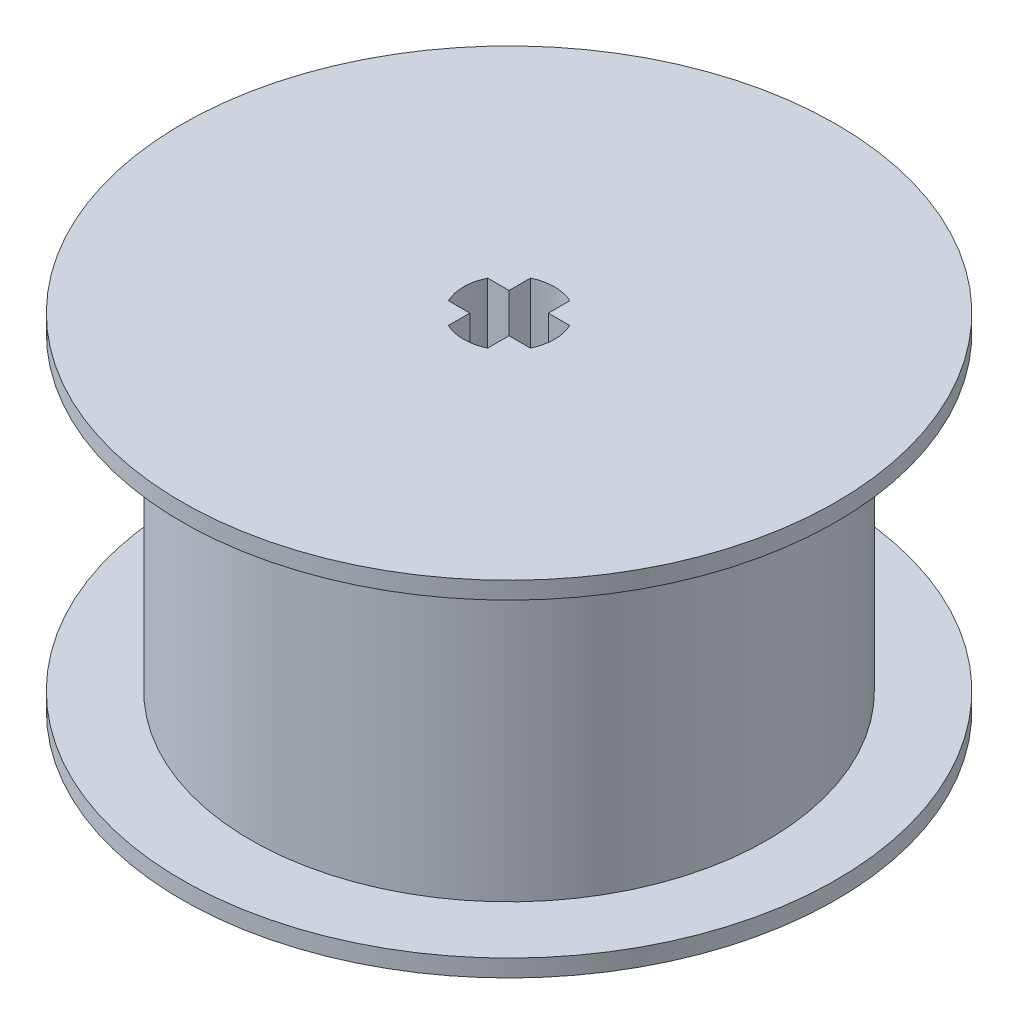
ISO-10303-21;
HEADER;
FILE_DESCRIPTION(('STEP AP214'),'2;1');
FILE_NAME('part.step','',(''),(''),'','','');
FILE_SCHEMA(('AUTOMOTIVE_DESIGN { 1 0 10303 214 1 1 1 1 }'));
ENDSEC;
DATA;
#1=APPLICATION_CONTEXT('core data for automotive mechanical design processes');
#2=APPLICATION_PROTOCOL_DEFINITION('international standard','automotive_design',2000,#1);
#3=PRODUCT_CONTEXT('',#1,'mechanical');
#4=PRODUCT('Part','Part','',(#3));
#5=PRODUCT_RELATED_PRODUCT_CATEGORY('part','',(#4));
#6=PRODUCT_DEFINITION_FORMATION('','',#4);
#7=PRODUCT_DEFINITION_CONTEXT('part definition',#1,'design');
#8=PRODUCT_DEFINITION('design','',#6,#7);
#9=PRODUCT_DEFINITION_SHAPE('','',#8);
#10=(LENGTH_UNIT() NAMED_UNIT(*) SI_UNIT(.MILLI.,.METRE.));
#11=(NAMED_UNIT(*) PLANE_ANGLE_UNIT() SI_UNIT($,.RADIAN.));
#12=(NAMED_UNIT(*) SI_UNIT($,.STERADIAN.) SOLID_ANGLE_UNIT());
#13=UNCERTAINTY_MEASURE_WITH_UNIT(LENGTH_MEASURE(1.E-05),#10,'distance_accuracy_value','');
#14=(GEOMETRIC_REPRESENTATION_CONTEXT(3) GLOBAL_UNCERTAINTY_ASSIGNED_CONTEXT((#13)) GLOBAL_UNIT_ASSIGNED_CONTEXT((#10,
#11,#12)) REPRESENTATION_CONTEXT('',''));
#15=CARTESIAN_POINT('',(0.,0.,0.));
#16=DIRECTION('',(0.,0.,1.));
#17=DIRECTION('',(1.,0.,0.));
#18=AXIS2_PLACEMENT_3D('',#15,#16,#17);
#19=CARTESIAN_POINT('',(0.,0.,0.));
#20=DIRECTION('',(0.,1.,0.));
#21=DIRECTION('',(0.,0.,1.));
#22=AXIS2_PLACEMENT_3D('',#19,#20,#21);
#23=PLANE('',#22);
#24=DIRECTION('',(0.,0.,1.));
#25=VECTOR('',#24,1.);
#26=CARTESIAN_POINT('',(-1.14,0.,-2.38117617995813));
#27=LINE('',#26,#25);
#28=CARTESIAN_POINT('',(-1.14,0.,-2.38117617995813));
#29=VERTEX_POINT('',#28);
#30=CARTESIAN_POINT('',(-1.14,0.,-1.14000000000001));
#31=VERTEX_POINT('',#30);
#32=EDGE_CURVE('E60',#29,#31,#27,.T.);
#33=ORIENTED_EDGE('',*,*,#32,.F.);
#34=CARTESIAN_POINT('',(0.,0.,0.));
#35=DIRECTION('',(0.,1.,0.));
#36=DIRECTION('',(0.,0.,-1.));
#37=AXIS2_PLACEMENT_3D('',#34,#35,#36);
#38=CIRCLE('',#37,2.64);
#39=CARTESIAN_POINT('',(1.14,0.,-2.38117617995813));
#40=VERTEX_POINT('',#39);
#41=EDGE_CURVE('E153',#40,#29,#38,.T.);
#42=ORIENTED_EDGE('',*,*,#41,.F.);
#43=DIRECTION('',(0.,0.,-1.));
#44=VECTOR('',#43,1.);
#45=CARTESIAN_POINT('',(1.14,0.,-2.38117617995813));
#46=LINE('',#45,#44);
#47=CARTESIAN_POINT('',(1.14,0.,-1.14));
#48=VERTEX_POINT('',#47);
#49=EDGE_CURVE('E156',#48,#40,#46,.T.);
#50=ORIENTED_EDGE('',*,*,#49,.F.);
#51=DIRECTION('',(-1.,0.,0.));
#52=VECTOR('',#51,1.);
#53=CARTESIAN_POINT('',(1.14,0.,-1.14));
#54=LINE('',#53,#52);
#55=CARTESIAN_POINT('',(2.38117617995813,0.,-1.14));
#56=VERTEX_POINT('',#55);
#57=EDGE_CURVE('E208',#56,#48,#54,.T.);
#58=ORIENTED_EDGE('',*,*,#57,.F.);
#59=CARTESIAN_POINT('',(0.,0.,0.));
#60=DIRECTION('',(0.,1.,0.));
#61=DIRECTION('',(0.,0.,-1.));
#62=AXIS2_PLACEMENT_3D('',#59,#60,#61);
#63=CIRCLE('',#62,2.64);
#64=CARTESIAN_POINT('',(2.38117617995813,0.,1.14));
#65=VERTEX_POINT('',#64);
#66=EDGE_CURVE('E205',#65,#56,#63,.T.);
#67=ORIENTED_EDGE('',*,*,#66,.F.);
#68=DIRECTION('',(1.,0.,0.));
#69=VECTOR('',#68,1.);
#70=CARTESIAN_POINT('',(1.14,0.,1.14));
#71=LINE('',#70,#69);
#72=CARTESIAN_POINT('',(1.14,0.,1.14));
#73=VERTEX_POINT('',#72);
#74=EDGE_CURVE('E202',#73,#65,#71,.T.);
#75=ORIENTED_EDGE('',*,*,#74,.F.);
#76=DIRECTION('',(0.,0.,-1.));
#77=VECTOR('',#76,1.);
#78=CARTESIAN_POINT('',(1.14,0.,2.38117617995813));
#79=LINE('',#78,#77);
#80=CARTESIAN_POINT('',(1.14,0.,2.38117617995813));
#81=VERTEX_POINT('',#80);
#82=EDGE_CURVE('E199',#81,#73,#79,.T.);
#83=ORIENTED_EDGE('',*,*,#82,.F.);
#84=CARTESIAN_POINT('',(0.,0.,0.));
#85=DIRECTION('',(0.,1.,0.));
#86=DIRECTION('',(0.,0.,1.));
#87=AXIS2_PLACEMENT_3D('',#84,#85,#86);
#88=CIRCLE('',#87,2.64);
#89=CARTESIAN_POINT('',(-1.14,0.,2.38117617995813));
#90=VERTEX_POINT('',#89);
#91=EDGE_CURVE('E196',#90,#81,#88,.T.);
#92=ORIENTED_EDGE('',*,*,#91,.F.);
#93=DIRECTION('',(0.,0.,1.));
#94=VECTOR('',#93,1.);
#95=CARTESIAN_POINT('',(-1.14,0.,1.14000000000001));
#96=LINE('',#95,#94);
#97=CARTESIAN_POINT('',(-1.14,0.,1.14000000000001));
#98=VERTEX_POINT('',#97);
#99=EDGE_CURVE('E193',#98,#90,#96,.T.);
#100=ORIENTED_EDGE('',*,*,#99,.F.);
#101=DIRECTION('',(1.,0.,0.));
#102=VECTOR('',#101,1.);
#103=CARTESIAN_POINT('',(-2.38117617995813,0.,1.14000000000001));
#104=LINE('',#103,#102);
#105=CARTESIAN_POINT('',(-2.38117617995813,0.,1.14000000000001));
#106=VERTEX_POINT('',#105);
#107=EDGE_CURVE('E190',#106,#98,#104,.T.);
#108=ORIENTED_EDGE('',*,*,#107,.F.);
#109=CARTESIAN_POINT('',(0.,0.,0.));
#110=DIRECTION('',(0.,1.,0.));
#111=DIRECTION('',(0.,0.,1.));
#112=AXIS2_PLACEMENT_3D('',#109,#110,#111);
#113=CIRCLE('',#112,2.64);
#114=CARTESIAN_POINT('',(-2.38117617995813,0.,-1.14000000000001));
#115=VERTEX_POINT('',#114);
#116=EDGE_CURVE('E187',#115,#106,#113,.T.);
#117=ORIENTED_EDGE('',*,*,#116,.F.);
#118=DIRECTION('',(-1.,0.,0.));
#119=VECTOR('',#118,1.);
#120=CARTESIAN_POINT('',(-1.14,0.,-1.14000000000001));
#121=LINE('',#120,#119);
#122=EDGE_CURVE('E185',#31,#115,#121,.T.);
#123=ORIENTED_EDGE('',*,*,#122,.F.);
#124=EDGE_LOOP('',(#33,#42,#50,#58,#67,#75,#83,#92,#100,#108,#117,#123));
#125=FACE_BOUND('',#124,.T.);
#126=CARTESIAN_POINT('',(0.,0.,0.));
#127=DIRECTION('',(0.,-1.,0.));
#128=DIRECTION('',(0.,0.,-1.));
#129=AXIS2_PLACEMENT_3D('',#126,#127,#128);
#130=CIRCLE('',#129,19.);
#131=CARTESIAN_POINT('',(0.,0.,-19.));
#132=VERTEX_POINT('',#131);
#133=EDGE_CURVE('E11',#132,#132,#130,.T.);
#134=ORIENTED_EDGE('',*,*,#133,.F.);
#135=EDGE_LOOP('',(#134));
#136=FACE_BOUND('',#135,.T.);
#137=ADVANCED_FACE('F39',(#125,#136),#23,.T.);
#138=CARTESIAN_POINT('',(0.,0.,0.));
#139=DIRECTION('',(0.,-1.,0.));
#140=DIRECTION('',(0.,0.,-1.));
#141=AXIS2_PLACEMENT_3D('',#138,#139,#140);
#142=CYLINDRICAL_SURFACE('',#141,19.);
#143=ORIENTED_EDGE('',*,*,#133,.T.);
#144=EDGE_LOOP('',(#143));
#145=FACE_BOUND('',#144,.T.);
#146=CARTESIAN_POINT('',(0.,-1.00000000003674,0.));
#147=DIRECTION('',(0.,-1.,0.));
#148=DIRECTION('',(0.,0.,-1.));
#149=AXIS2_PLACEMENT_3D('',#146,#147,#148);
#150=CIRCLE('',#149,19.);
#151=CARTESIAN_POINT('',(0.,-1.00000000003674,-19.));
#152=VERTEX_POINT('',#151);
#153=EDGE_CURVE('E52',#152,#152,#150,.T.);
#154=ORIENTED_EDGE('',*,*,#153,.F.);
#155=EDGE_LOOP('',(#154));
#156=FACE_BOUND('',#155,.T.);
#157=ADVANCED_FACE('F321',(#145,#156),#142,.T.);
#158=CARTESIAN_POINT('',(19.,-1.00000000003674,0.));
#159=DIRECTION('',(0.,-1.,0.));
#160=DIRECTION('',(0.,0.,-1.));
#161=AXIS2_PLACEMENT_3D('',#158,#159,#160);
#162=PLANE('',#161);
#163=ORIENTED_EDGE('',*,*,#153,.T.);
#164=EDGE_LOOP('',(#163));
#165=FACE_BOUND('',#164,.T.);
#166=CARTESIAN_POINT('',(0.,-1.00000000003674,0.));
#167=DIRECTION('',(0.,-1.,0.));
#168=DIRECTION('',(0.,0.,-1.));
#169=AXIS2_PLACEMENT_3D('',#166,#167,#168);
#170=CIRCLE('',#169,15.);
#171=CARTESIAN_POINT('',(0.,-1.00000000003674,-15.));
#172=VERTEX_POINT('',#171);
#173=EDGE_CURVE('E243',#172,#172,#170,.T.);
#174=ORIENTED_EDGE('',*,*,#173,.F.);
#175=EDGE_LOOP('',(#174));
#176=FACE_BOUND('',#175,.T.);
#177=ADVANCED_FACE('F317',(#165,#176),#162,.T.);
#178=CARTESIAN_POINT('',(0.,0.,0.));
#179=DIRECTION('',(0.,-1.,0.));
#180=DIRECTION('',(0.,0.,-1.));
#181=AXIS2_PLACEMENT_3D('',#178,#179,#180);
#182=CYLINDRICAL_SURFACE('',#181,15.);
#183=CARTESIAN_POINT('',(-6.53834841531102,-10.,-13.5));
#184=CARTESIAN_POINT('',(-6.53835429126218,-10.0405016305336,-13.4999973519819));
#185=CARTESIAN_POINT('',(-6.54178157028006,-10.0810615852994,-13.4983388832959));
#186=CARTESIAN_POINT('',(-6.55507308129075,-10.1608838437564,-13.4918889448347));
#187=CARTESIAN_POINT('',(-6.56495346795088,-10.2001426302494,-13.4870896121804));
#188=CARTESIAN_POINT('',(-6.59343086179107,-10.2864994275955,-13.4731947553589));
#189=CARTESIAN_POINT('',(-6.61364096152651,-10.3329288663731,-13.4632992649842));
#190=CARTESIAN_POINT('',(-6.66032970063838,-10.4216053361737,-13.4402637496393));
#191=CARTESIAN_POINT('',(-6.68682091248429,-10.4638437345906,-13.4271172149793));
#192=CARTESIAN_POINT('',(-6.76372444927527,-10.5717913416363,-13.3886109557115));
#193=CARTESIAN_POINT('',(-6.81811878371292,-10.6338322441521,-13.3610415174007));
#194=CARTESIAN_POINT('',(-6.93371129068838,-10.7486536141605,-13.3014259206052));
#195=CARTESIAN_POINT('',(-6.99492843184171,-10.8014071566226,-13.2693672144329));
#196=CARTESIAN_POINT('',(-7.12078187083078,-10.8989133143383,-13.2022538736608));
#197=CARTESIAN_POINT('',(-7.18538113839335,-10.9437356791897,-13.1672298246477));
#198=CARTESIAN_POINT('',(-7.31707104039202,-11.027188313925,-13.0945081380897));
#199=CARTESIAN_POINT('',(-7.38416389839497,-11.0658128856699,-13.0568080856782));
#200=CARTESIAN_POINT('',(-7.52003792075561,-11.137677719715,-12.9790281437519));
#201=CARTESIAN_POINT('',(-7.58882226093293,-11.1709067946085,-12.9389435391236));
#202=CARTESIAN_POINT('',(-7.72737151439541,-11.2323691155415,-12.8566802804563));
#203=CARTESIAN_POINT('',(-7.79713667141198,-11.2606010952483,-12.8145010990805));
#204=CARTESIAN_POINT('',(-7.96868961680108,-11.3239680620282,-12.708823086312));
#205=CARTESIAN_POINT('',(-8.07078698156116,-11.356508579231,-12.6442571838885));
#206=CARTESIAN_POINT('',(-8.27523656311224,-11.4119633650581,-12.5114084661272));
#207=CARTESIAN_POINT('',(-8.37758888623962,-11.4348725263219,-12.4431237003566));
#208=CARTESIAN_POINT('',(-8.58161097503527,-11.4707857532133,-12.3033010942913));
#209=CARTESIAN_POINT('',(-8.68328150279866,-11.4838038189781,-12.2317680044299));
#210=CARTESIAN_POINT('',(-8.88527489739756,-11.499336842331,-12.0858352082563));
#211=CARTESIAN_POINT('',(-8.98559853716563,-11.5018581051188,-12.011437249924));
#212=CARTESIAN_POINT('',(-9.21463010487043,-11.494407571697,-11.8371081982897));
#213=CARTESIAN_POINT('',(-9.34261048720523,-11.4803686547908,-11.7363419483686));
#214=CARTESIAN_POINT('',(-9.59243197710365,-11.4293045715253,-11.5330406681261));
#215=CARTESIAN_POINT('',(-9.71428352186695,-11.3923200199036,-11.4305090736368));
#216=CARTESIAN_POINT('',(-9.91346875256681,-11.3058747108413,-11.2576678893414));
#217=CARTESIAN_POINT('',(-9.99330650404348,-11.2633437082381,-11.1868009789055));
#218=CARTESIAN_POINT('',(-10.1459795190701,-11.1627397569323,-11.0485123468994));
#219=CARTESIAN_POINT('',(-10.2188243874304,-11.1046885528527,-10.9810859611722));
#220=CARTESIAN_POINT('',(-10.3365350001259,-10.9889998670556,-10.8701788665022));
#221=CARTESIAN_POINT('',(-10.3837132361054,-10.9352904369161,-10.8250725128944));
#222=CARTESIAN_POINT('',(-10.4708974295383,-10.81823114901,-10.7407619024324));
#223=CARTESIAN_POINT('',(-10.5109131229372,-10.7548945973138,-10.7015496456189));
#224=CARTESIAN_POINT('',(-10.5749249286873,-10.6320469110136,-10.6382609821206));
#225=CARTESIAN_POINT('',(-10.6005214358104,-10.5741291907398,-10.6127240439285));
#226=CARTESIAN_POINT('',(-10.6444935080157,-10.4530899743706,-10.5686201068699));
#227=CARTESIAN_POINT('',(-10.6628728358564,-10.3899712107217,-10.5500494762658));
#228=CARTESIAN_POINT('',(-10.6914200185456,-10.2596063561992,-10.5211198511226));
#229=CARTESIAN_POINT('',(-10.7015347629681,-10.1923365127666,-10.5108139758285));
#230=CARTESIAN_POINT('',(-10.7126307626969,-10.0562776421528,-10.4995052705286));
#231=CARTESIAN_POINT('',(-10.7136162264551,-9.98748932962245,-10.498498153945));
#232=CARTESIAN_POINT('',(-10.7067846399155,-9.85821098137139,-10.5054640690018));
#233=CARTESIAN_POINT('',(-10.6998921814574,-9.79761614017976,-10.5124938705573));
#234=CARTESIAN_POINT('',(-10.6791807043203,-9.67889353313731,-10.5335328936008));
#235=CARTESIAN_POINT('',(-10.6653614899103,-9.6207658370516,-10.5475423123137));
#236=CARTESIAN_POINT('',(-10.6311299110019,-9.5070346492436,-10.582044858114));
#237=CARTESIAN_POINT('',(-10.6105791125476,-9.45151488594607,-10.6026739179409));
#238=CARTESIAN_POINT('',(-10.5638934484072,-9.34526151956065,-10.6491898066595));
#239=CARTESIAN_POINT('',(-10.5377558039763,-9.29453031633951,-10.6750792516055));
#240=CARTESIAN_POINT('',(-10.4673514387406,-9.17556767854391,-10.7442065581145));
#241=CARTESIAN_POINT('',(-10.4203466585636,-9.11035877698943,-10.789869652819));
#242=CARTESIAN_POINT('',(-10.3186942756334,-8.99131162082975,-10.8871269396656));
#243=CARTESIAN_POINT('',(-10.264030025045,-8.93749879310096,-10.938734006318));
#244=CARTESIAN_POINT('',(-10.1246636360607,-8.82010101453543,-11.0681337321942));
#245=CARTESIAN_POINT('',(-10.037043865499,-8.76202738517832,-11.1477609470822));
#246=CARTESIAN_POINT('',(-9.85419165409301,-8.66490914856395,-11.3097266638254));
#247=CARTESIAN_POINT('',(-9.75894645495867,-8.62589724242037,-11.3920695680871));
#248=CARTESIAN_POINT('',(-9.58831945729434,-8.57215517257197,-11.5357374890118));
#249=CARTESIAN_POINT('',(-9.51405198034325,-8.55377203877791,-11.5970778212664));
#250=CARTESIAN_POINT('',(-9.36336448090554,-8.52520795296039,-11.719078546046));
#251=CARTESIAN_POINT('',(-9.28694340672785,-8.51503108283482,-11.7797385854106));
#252=CARTESIAN_POINT('',(-9.13244008207584,-8.50212086820539,-11.8999217147279));
#253=CARTESIAN_POINT('',(-9.05435556201105,-8.49939845022535,-11.9594430088742));
#254=CARTESIAN_POINT('',(-8.89709376930322,-8.50082161332319,-12.0768933780442));
#255=CARTESIAN_POINT('',(-8.81791667043208,-8.50496611444033,-12.1348227019807));
#256=CARTESIAN_POINT('',(-8.6554271934134,-8.51998319610775,-12.2512854712461));
#257=CARTESIAN_POINT('',(-8.57208317789145,-8.53113689817291,-12.3097381412123));
#258=CARTESIAN_POINT('',(-8.40501218139731,-8.56007949212183,-12.4244130098181));
#259=CARTESIAN_POINT('',(-8.32128517295241,-8.5778688676062,-12.4806350455611));
#260=CARTESIAN_POINT('',(-8.15398161299101,-8.61989835076576,-12.5905752236938));
#261=CARTESIAN_POINT('',(-8.07040501871651,-8.64412911221757,-12.6442968624125));
#262=CARTESIAN_POINT('',(-7.90379309562159,-8.69910146506953,-12.7491076867998));
#263=CARTESIAN_POINT('',(-7.82075760462673,-8.72984100357186,-12.8001976961942));
#264=CARTESIAN_POINT('',(-7.63604009929688,-8.80631296558693,-12.9114323032474));
#265=CARTESIAN_POINT('',(-7.53464021120842,-8.85387275107374,-12.9708258665554));
#266=CARTESIAN_POINT('',(-7.38515224635336,-8.93412827837651,-13.0561417761549));
#267=CARTESIAN_POINT('',(-7.33573806961938,-8.96237981078635,-13.0839622101497));
#268=CARTESIAN_POINT('',(-7.23815391541254,-9.02217851039933,-13.1381977392378));
#269=CARTESIAN_POINT('',(-7.18998364382187,-9.05372488947938,-13.1646131681352));
#270=CARTESIAN_POINT('',(-7.07336572376163,-9.13604496427244,-13.227762269043));
#271=CARTESIAN_POINT('',(-7.00589850684287,-9.18894080425484,-13.2635858536544));
#272=CARTESIAN_POINT('',(-6.87735217958041,-9.30449086762637,-13.3306870399593));
#273=CARTESIAN_POINT('',(-6.81625404063946,-9.36711454480026,-13.3619782985551));
#274=CARTESIAN_POINT('',(-6.73187816208705,-9.47211904976236,-13.4045852683564));
#275=CARTESIAN_POINT('',(-6.70437379067559,-9.51007770054133,-13.4183520280532));
#276=CARTESIAN_POINT('',(-6.65397606472866,-9.5897591992035,-13.4434142795373));
#277=CARTESIAN_POINT('',(-6.63108006275475,-9.6314798658015,-13.4547111905388));
#278=CARTESIAN_POINT('',(-6.59468030973018,-9.71202681689303,-13.472584849673));
#279=CARTESIAN_POINT('',(-6.58028080854931,-9.75034055285035,-13.4796165355107));
#280=CARTESIAN_POINT('',(-6.55741568335751,-9.82907164609291,-13.4907548185578));
#281=CARTESIAN_POINT('',(-6.54893235569477,-9.86948233507261,-13.494870143335));
#282=CARTESIAN_POINT('',(-6.54204465665132,-9.92521786548193,-13.4982093087091));
#283=CARTESIAN_POINT('',(-6.54066214604548,-9.94012917549613,-13.4988792091831));
#284=CARTESIAN_POINT('',(-6.53881284514107,-9.97002431721489,-13.4997750898697));
#285=CARTESIAN_POINT('',(-6.53834624030471,-9.98500816299163,-13.5000009801743));
#286=CARTESIAN_POINT('',(-6.53834841531102,-10.,-13.5));
#287=B_SPLINE_CURVE_WITH_KNOTS('',3,(#183,#184,#185,#186,#187,#188,#189,#190,#191,#192,#193,
#194,#195,#196,#197,#198,#199,#200,#201,#202,#203,#204,#205,#206,#207,#208,#209,#210,#211,#212,
#213,#214,#215,#216,#217,#218,#219,#220,#221,#222,#223,#224,#225,#226,#227,#228,#229,#230,#231,
#232,#233,#234,#235,#236,#237,#238,#239,#240,#241,#242,#243,#244,#245,#246,#247,#248,#249,#250,
#251,#252,#253,#254,#255,#256,#257,#258,#259,#260,#261,#262,#263,#264,#265,#266,#267,#268,#269,
#270,#271,#272,#273,#274,#275,#276,#277,#278,#279,#280,#281,#282,#283,#284,#285,#286),
.UNSPECIFIED.,.T.,.F.,(4,2,2,2,2,2,2,2,2,2,2,2,2,2,2,2,2,2,2,2,2,2,2,2,2,2,2,2,2,2,2,2,2,2,2,2,
2,2,2,2,2,2,2,2,2,2,2,2,2,2,2,4),(0.,0.121439420041992,0.243184022044381,0.397087579827664,
0.55130183584928,0.810822442907293,1.07108346281782,1.32892762791405,1.58700750858907,
1.84561585945676,2.10428965170149,2.47914056641775,2.85419000886441,3.22870760163308,
3.60300019739216,4.09204400132706,4.58022463715456,4.92395551843944,5.26720731564088,
5.51993902789394,5.77232455250974,5.97633765736867,6.1802442559988,6.38545112950289,
6.59056340122062,6.77387176033376,6.95718529953153,7.1445339772348,7.33197605479737,
7.60777064878839,7.88417425821165,8.27762216586976,8.67174269905323,8.96555264762777,
9.25950865093959,9.55389529652888,9.84823564830917,10.1552084893841,10.462203706676,
10.7687558932824,11.0752115355814,11.4548455852621,11.6448219553577,11.834752986972,
12.1129538612206,12.390298191189,12.536556050179,12.6827296449037,12.8068562382908,
12.9306097807685,12.9755519578145,13.020503234286),.UNSPECIFIED.);
#288=CARTESIAN_POINT('',(-6.53834841531102,-10.,-13.5));
#289=VERTEX_POINT('',#288);
#290=EDGE_CURVE('E42',#289,#289,#287,.T.);
#291=ORIENTED_EDGE('',*,*,#290,.F.);
#292=EDGE_LOOP('',(#291));
#293=FACE_BOUND('',#292,.T.);
#294=CARTESIAN_POINT('',(6.53834841531102,-10.,-13.5));
#295=CARTESIAN_POINT('',(6.53835429126218,-9.95949836946645,-13.4999973519819));
#296=CARTESIAN_POINT('',(6.54178157028006,-9.91893841470063,-13.4983388832959));
#297=CARTESIAN_POINT('',(6.55507308129075,-9.83911615624359,-13.4918889448347));
#298=CARTESIAN_POINT('',(6.56495346795088,-9.79985736975057,-13.4870896121804));
#299=CARTESIAN_POINT('',(6.59343086179107,-9.71350057240451,-13.4731947553589));
#300=CARTESIAN_POINT('',(6.61364096152651,-9.66707113362695,-13.4632992649842));
#301=CARTESIAN_POINT('',(6.66032970063838,-9.57839466382634,-13.4402637496393));
#302=CARTESIAN_POINT('',(6.68682091248429,-9.53615626540945,-13.4271172149793));
#303=CARTESIAN_POINT('',(6.76372444927527,-9.42820865836374,-13.3886109557115));
#304=CARTESIAN_POINT('',(6.81811878371292,-9.36616775584793,-13.3610415174007));
#305=CARTESIAN_POINT('',(6.93371129068838,-9.25134638583947,-13.3014259206052));
#306=CARTESIAN_POINT('',(6.99492843184171,-9.19859284337741,-13.2693672144329));
#307=CARTESIAN_POINT('',(7.12078187083078,-9.10108668566171,-13.2022538736608));
#308=CARTESIAN_POINT('',(7.18538113839335,-9.05626432081027,-13.1672298246477));
#309=CARTESIAN_POINT('',(7.31707104039202,-8.97281168607505,-13.0945081380897));
#310=CARTESIAN_POINT('',(7.38416389839497,-8.93418711433009,-13.0568080856782));
#311=CARTESIAN_POINT('',(7.52003792075561,-8.86232228028498,-12.9790281437519));
#312=CARTESIAN_POINT('',(7.58882226093293,-8.82909320539147,-12.9389435391236));
#313=CARTESIAN_POINT('',(7.72737151439541,-8.76763088445854,-12.8566802804563));
#314=CARTESIAN_POINT('',(7.79713667141198,-8.73939890475175,-12.8145010990805));
#315=CARTESIAN_POINT('',(7.96868961680108,-8.67603193797181,-12.708823086312));
#316=CARTESIAN_POINT('',(8.07078698156116,-8.64349142076901,-12.6442571838885));
#317=CARTESIAN_POINT('',(8.27523656311224,-8.58803663494194,-12.5114084661272));
#318=CARTESIAN_POINT('',(8.37758888623962,-8.56512747367806,-12.4431237003566));
#319=CARTESIAN_POINT('',(8.58161097503527,-8.52921424678673,-12.3033010942913));
#320=CARTESIAN_POINT('',(8.68328150279866,-8.51619618102187,-12.2317680044299));
#321=CARTESIAN_POINT('',(8.88527489739756,-8.50066315766904,-12.0858352082563));
#322=CARTESIAN_POINT('',(8.98559853716563,-8.49814189488121,-12.011437249924));
#323=CARTESIAN_POINT('',(9.21463010487043,-8.50559242830305,-11.8371081982897));
#324=CARTESIAN_POINT('',(9.34261048720523,-8.5196313452092,-11.7363419483686));
#325=CARTESIAN_POINT('',(9.59243197710365,-8.57069542847466,-11.5330406681261));
#326=CARTESIAN_POINT('',(9.71428352186695,-8.60767998009641,-11.4305090736368));
#327=CARTESIAN_POINT('',(9.91346875256681,-8.69412528915875,-11.2576678893414));
#328=CARTESIAN_POINT('',(9.99330650404348,-8.73665629176189,-11.1868009789055));
#329=CARTESIAN_POINT('',(10.1459795190701,-8.83726024306774,-11.0485123468994));
#330=CARTESIAN_POINT('',(10.2188243874304,-8.89531144714728,-10.9810859611722));
#331=CARTESIAN_POINT('',(10.3365350001259,-9.01100013294441,-10.8701788665022));
#332=CARTESIAN_POINT('',(10.3837132361054,-9.06470956308387,-10.8250725128944));
#333=CARTESIAN_POINT('',(10.4708974295383,-9.18176885099,-10.7407619024324));
#334=CARTESIAN_POINT('',(10.5109131229372,-9.24510540268617,-10.7015496456189));
#335=CARTESIAN_POINT('',(10.5749249286873,-9.36795308898638,-10.6382609821206));
#336=CARTESIAN_POINT('',(10.6005214358104,-9.42587080926025,-10.6127240439285));
#337=CARTESIAN_POINT('',(10.6444935080157,-9.54691002562945,-10.5686201068699));
#338=CARTESIAN_POINT('',(10.6628728358564,-9.6100287892783,-10.5500494762658));
#339=CARTESIAN_POINT('',(10.6914200185456,-9.74039364380085,-10.5211198511226));
#340=CARTESIAN_POINT('',(10.7015347629681,-9.80766348723338,-10.5108139758285));
#341=CARTESIAN_POINT('',(10.7126307626969,-9.94372235784718,-10.4995052705286));
#342=CARTESIAN_POINT('',(10.7136162264551,-10.0125106703776,-10.498498153945));
#343=CARTESIAN_POINT('',(10.7067846399155,-10.1417890186286,-10.5054640690018));
#344=CARTESIAN_POINT('',(10.6998921814574,-10.2023838598202,-10.5124938705573));
#345=CARTESIAN_POINT('',(10.6791807043203,-10.3211064668627,-10.5335328936008));
#346=CARTESIAN_POINT('',(10.6653614899103,-10.3792341629484,-10.5475423123137));
#347=CARTESIAN_POINT('',(10.6311299110019,-10.4929653507564,-10.582044858114));
#348=CARTESIAN_POINT('',(10.6105791125476,-10.5484851140539,-10.6026739179409));
#349=CARTESIAN_POINT('',(10.5638934484072,-10.6547384804394,-10.6491898066595));
#350=CARTESIAN_POINT('',(10.5377558039763,-10.7054696836605,-10.6750792516055));
#351=CARTESIAN_POINT('',(10.4673514387406,-10.8244323214561,-10.7442065581145));
#352=CARTESIAN_POINT('',(10.4203466585636,-10.8896412230106,-10.789869652819));
#353=CARTESIAN_POINT('',(10.3186942756334,-11.0086883791703,-10.8871269396656));
#354=CARTESIAN_POINT('',(10.264030025045,-11.062501206899,-10.938734006318));
#355=CARTESIAN_POINT('',(10.1246636360607,-11.1798989854646,-11.0681337321942));
#356=CARTESIAN_POINT('',(10.037043865499,-11.2379726148217,-11.1477609470822));
#357=CARTESIAN_POINT('',(9.85419165409301,-11.3350908514361,-11.3097266638254));
#358=CARTESIAN_POINT('',(9.75894645495867,-11.3741027575796,-11.3920695680871));
#359=CARTESIAN_POINT('',(9.58831945729434,-11.427844827428,-11.5357374890118));
#360=CARTESIAN_POINT('',(9.51405198034325,-11.4462279612221,-11.5970778212664));
#361=CARTESIAN_POINT('',(9.36336448090554,-11.4747920470396,-11.719078546046));
#362=CARTESIAN_POINT('',(9.28694340672785,-11.4849689171652,-11.7797385854106));
#363=CARTESIAN_POINT('',(9.13244008207584,-11.4978791317946,-11.8999217147279));
#364=CARTESIAN_POINT('',(9.05435556201105,-11.5006015497747,-11.9594430088742));
#365=CARTESIAN_POINT('',(8.89709376930322,-11.4991783866768,-12.0768933780442));
#366=CARTESIAN_POINT('',(8.81791667043208,-11.4950338855597,-12.1348227019807));
#367=CARTESIAN_POINT('',(8.6554271934134,-11.4800168038923,-12.2512854712461));
#368=CARTESIAN_POINT('',(8.57208317789145,-11.4688631018271,-12.3097381412123));
#369=CARTESIAN_POINT('',(8.40501218139731,-11.4399205078782,-12.4244130098181));
#370=CARTESIAN_POINT('',(8.32128517295241,-11.4221311323938,-12.4806350455611));
#371=CARTESIAN_POINT('',(8.15398161299101,-11.3801016492343,-12.5905752236938));
#372=CARTESIAN_POINT('',(8.07040501871651,-11.3558708877824,-12.6442968624125));
#373=CARTESIAN_POINT('',(7.90379309562159,-11.3008985349305,-12.7491076867998));
#374=CARTESIAN_POINT('',(7.82075760462673,-11.2701589964281,-12.8001976961942));
#375=CARTESIAN_POINT('',(7.63604009929688,-11.1936870344131,-12.9114323032474));
#376=CARTESIAN_POINT('',(7.53464021120842,-11.1461272489263,-12.9708258665554));
#377=CARTESIAN_POINT('',(7.38515224635336,-11.0658717216235,-13.0561417761549));
#378=CARTESIAN_POINT('',(7.33573806961938,-11.0376201892137,-13.0839622101497));
#379=CARTESIAN_POINT('',(7.23815391541254,-10.9778214896007,-13.1381977392378));
#380=CARTESIAN_POINT('',(7.18998364382187,-10.9462751105206,-13.1646131681352));
#381=CARTESIAN_POINT('',(7.07336572376163,-10.8639550357276,-13.227762269043));
#382=CARTESIAN_POINT('',(7.00589850684287,-10.8110591957452,-13.2635858536544));
#383=CARTESIAN_POINT('',(6.87735217958041,-10.6955091323736,-13.3306870399593));
#384=CARTESIAN_POINT('',(6.81625404063946,-10.6328854551997,-13.3619782985551));
#385=CARTESIAN_POINT('',(6.73187816208705,-10.5278809502376,-13.4045852683564));
#386=CARTESIAN_POINT('',(6.70437379067559,-10.4899222994587,-13.4183520280532));
#387=CARTESIAN_POINT('',(6.65397606472866,-10.4102408007965,-13.4434142795373));
#388=CARTESIAN_POINT('',(6.63108006275475,-10.3685201341985,-13.4547111905388));
#389=CARTESIAN_POINT('',(6.59468030973018,-10.287973183107,-13.472584849673));
#390=CARTESIAN_POINT('',(6.58028080854931,-10.2496594471497,-13.4796165355107));
#391=CARTESIAN_POINT('',(6.55741568335751,-10.1709283539071,-13.4907548185578));
#392=CARTESIAN_POINT('',(6.54893235569477,-10.1305176649274,-13.494870143335));
#393=CARTESIAN_POINT('',(6.54204465665132,-10.0747821345181,-13.4982093087091));
#394=CARTESIAN_POINT('',(6.54066214604548,-10.0598708245039,-13.4988792091831));
#395=CARTESIAN_POINT('',(6.53881284514107,-10.0299756827851,-13.4997750898697));
#396=CARTESIAN_POINT('',(6.53834624030471,-10.0149918370084,-13.5000009801743));
#397=CARTESIAN_POINT('',(6.53834841531102,-10.,-13.5));
#398=B_SPLINE_CURVE_WITH_KNOTS('',3,(#294,#295,#296,#297,#298,#299,#300,#301,#302,#303,#304,
#305,#306,#307,#308,#309,#310,#311,#312,#313,#314,#315,#316,#317,#318,#319,#320,#321,#322,#323,
#324,#325,#326,#327,#328,#329,#330,#331,#332,#333,#334,#335,#336,#337,#338,#339,#340,#341,#342,
#343,#344,#345,#346,#347,#348,#349,#350,#351,#352,#353,#354,#355,#356,#357,#358,#359,#360,#361,
#362,#363,#364,#365,#366,#367,#368,#369,#370,#371,#372,#373,#374,#375,#376,#377,#378,#379,#380,
#381,#382,#383,#384,#385,#386,#387,#388,#389,#390,#391,#392,#393,#394,#395,#396,#397),
.UNSPECIFIED.,.T.,.F.,(4,2,2,2,2,2,2,2,2,2,2,2,2,2,2,2,2,2,2,2,2,2,2,2,2,2,2,2,2,2,2,2,2,2,2,2,
2,2,2,2,2,2,2,2,2,2,2,2,2,2,2,4),(0.,0.121439420041992,0.243184022044381,0.397087579827664,
0.55130183584928,0.810822442907293,1.07108346281782,1.32892762791405,1.58700750858907,
1.84561585945676,2.10428965170149,2.47914056641775,2.85419000886441,3.22870760163308,
3.60300019739216,4.09204400132706,4.58022463715456,4.92395551843944,5.26720731564088,
5.51993902789394,5.77232455250974,5.97633765736867,6.1802442559988,6.38545112950289,
6.59056340122062,6.77387176033376,6.95718529953153,7.1445339772348,7.33197605479737,
7.60777064878839,7.88417425821165,8.27762216586976,8.67174269905323,8.96555264762777,
9.25950865093959,9.55389529652888,9.84823564830917,10.1552084893841,10.462203706676,
10.7687558932824,11.0752115355814,11.4548455852621,11.6448219553577,11.834752986972,
12.1129538612206,12.390298191189,12.536556050179,12.6827296449037,12.8068562382908,
12.9306097807685,12.9755519578145,13.020503234286),.UNSPECIFIED.);
#399=CARTESIAN_POINT('',(6.53834841531102,-10.,-13.5));
#400=VERTEX_POINT('',#399);
#401=EDGE_CURVE('E247',#400,#400,#398,.T.);
#402=ORIENTED_EDGE('',*,*,#401,.F.);
#403=EDGE_LOOP('',(#402));
#404=FACE_BOUND('',#403,.T.);
#405=ORIENTED_EDGE('',*,*,#173,.T.);
#406=EDGE_LOOP('',(#405));
#407=FACE_BOUND('',#406,.T.);
#408=CARTESIAN_POINT('',(0.,-18.9999999999633,0.));
#409=DIRECTION('',(0.,-1.,0.));
#410=DIRECTION('',(0.,0.,-1.));
#411=AXIS2_PLACEMENT_3D('',#408,#409,#410);
#412=CIRCLE('',#411,15.);
#413=CARTESIAN_POINT('',(0.,-18.9999999999633,-15.));
#414=VERTEX_POINT('',#413);
#415=EDGE_CURVE('E240',#414,#414,#412,.T.);
#416=ORIENTED_EDGE('',*,*,#415,.F.);
#417=EDGE_LOOP('',(#416));
#418=FACE_BOUND('',#417,.T.);
#419=ADVANCED_FACE('F252',(#293,#404,#407,#418),#182,.T.);
#420=CARTESIAN_POINT('',(19.,-18.9999999999633,0.));
#421=DIRECTION('',(0.,1.,0.));
#422=DIRECTION('',(0.,0.,1.));
#423=AXIS2_PLACEMENT_3D('',#420,#421,#422);
#424=PLANE('',#423);
#425=ORIENTED_EDGE('',*,*,#415,.T.);
#426=EDGE_LOOP('',(#425));
#427=FACE_BOUND('',#426,.T.);
#428=CARTESIAN_POINT('',(0.,-18.9999999999633,0.));
#429=DIRECTION('',(0.,-1.,0.));
#430=DIRECTION('',(0.,0.,-1.));
#431=AXIS2_PLACEMENT_3D('',#428,#429,#430);
#432=CIRCLE('',#431,19.);
#433=CARTESIAN_POINT('',(0.,-18.9999999999633,-19.));
#434=VERTEX_POINT('',#433);
#435=EDGE_CURVE('E237',#434,#434,#432,.T.);
#436=ORIENTED_EDGE('',*,*,#435,.F.);
#437=EDGE_LOOP('',(#436));
#438=FACE_BOUND('',#437,.T.);
#439=ADVANCED_FACE('F309',(#427,#438),#424,.T.);
#440=CARTESIAN_POINT('',(0.,0.,0.));
#441=DIRECTION('',(0.,-1.,0.));
#442=DIRECTION('',(0.,0.,-1.));
#443=AXIS2_PLACEMENT_3D('',#440,#441,#442);
#444=CYLINDRICAL_SURFACE('',#443,19.);
#445=ORIENTED_EDGE('',*,*,#435,.T.);
#446=EDGE_LOOP('',(#445));
#447=FACE_BOUND('',#446,.T.);
#448=CARTESIAN_POINT('',(0.,-20.,0.));
#449=DIRECTION('',(0.,-1.,0.));
#450=DIRECTION('',(0.,0.,-1.));
#451=AXIS2_PLACEMENT_3D('',#448,#449,#450);
#452=CIRCLE('',#451,19.);
#453=CARTESIAN_POINT('',(0.,-20.,-19.));
#454=VERTEX_POINT('',#453);
#455=EDGE_CURVE('E215',#454,#454,#452,.T.);
#456=ORIENTED_EDGE('',*,*,#455,.F.);
#457=EDGE_LOOP('',(#456));
#458=FACE_BOUND('',#457,.T.);
#459=ADVANCED_FACE('F307',(#447,#458),#444,.T.);
#460=CARTESIAN_POINT('',(0.,-20.,0.));
#461=DIRECTION('',(0.,-1.,0.));
#462=DIRECTION('',(0.,0.,-1.));
#463=AXIS2_PLACEMENT_3D('',#460,#461,#462);
#464=PLANE('',#463);
#465=DIRECTION('',(0.,0.,1.));
#466=VECTOR('',#465,1.);
#467=CARTESIAN_POINT('',(-1.14,-20.,-2.38117617995813));
#468=LINE('',#467,#466);
#469=CARTESIAN_POINT('',(-1.14,-20.,-2.38117617995813));
#470=VERTEX_POINT('',#469);
#471=CARTESIAN_POINT('',(-1.14,-20.,-1.14000000000001));
#472=VERTEX_POINT('',#471);
#473=EDGE_CURVE('E136',#470,#472,#468,.T.);
#474=ORIENTED_EDGE('',*,*,#473,.T.);
#475=DIRECTION('',(-1.,0.,0.));
#476=VECTOR('',#475,1.);
#477=CARTESIAN_POINT('',(-1.14,-20.,-1.14000000000001));
#478=LINE('',#477,#476);
#479=CARTESIAN_POINT('',(-2.38117617995813,-20.,-1.14000000000001));
#480=VERTEX_POINT('',#479);
#481=EDGE_CURVE('E145',#472,#480,#478,.T.);
#482=ORIENTED_EDGE('',*,*,#481,.T.);
#483=CARTESIAN_POINT('',(0.,-20.,0.));
#484=DIRECTION('',(0.,1.,0.));
#485=DIRECTION('',(0.,0.,1.));
#486=AXIS2_PLACEMENT_3D('',#483,#484,#485);
#487=CIRCLE('',#486,2.64);
#488=CARTESIAN_POINT('',(-2.38117617995813,-20.,1.14000000000001));
#489=VERTEX_POINT('',#488);
#490=EDGE_CURVE('E68',#480,#489,#487,.T.);
#491=ORIENTED_EDGE('',*,*,#490,.T.);
#492=DIRECTION('',(1.,0.,0.));
#493=VECTOR('',#492,1.);
#494=CARTESIAN_POINT('',(-2.38117617995813,-20.,1.14000000000001));
#495=LINE('',#494,#493);
#496=CARTESIAN_POINT('',(-1.14,-20.,1.14000000000001));
#497=VERTEX_POINT('',#496);
#498=EDGE_CURVE('E160',#489,#497,#495,.T.);
#499=ORIENTED_EDGE('',*,*,#498,.T.);
#500=DIRECTION('',(0.,0.,1.));
#501=VECTOR('',#500,1.);
#502=CARTESIAN_POINT('',(-1.14,-20.,1.14000000000001));
#503=LINE('',#502,#501);
#504=CARTESIAN_POINT('',(-1.14,-20.,2.38117617995813));
#505=VERTEX_POINT('',#504);
#506=EDGE_CURVE('E163',#497,#505,#503,.T.);
#507=ORIENTED_EDGE('',*,*,#506,.T.);
#508=CARTESIAN_POINT('',(0.,-20.,0.));
#509=DIRECTION('',(0.,1.,0.));
#510=DIRECTION('',(0.,0.,1.));
#511=AXIS2_PLACEMENT_3D('',#508,#509,#510);
#512=CIRCLE('',#511,2.64);
#513=CARTESIAN_POINT('',(1.14,-20.,2.38117617995813));
#514=VERTEX_POINT('',#513);
#515=EDGE_CURVE('E166',#505,#514,#512,.T.);
#516=ORIENTED_EDGE('',*,*,#515,.T.);
#517=DIRECTION('',(0.,0.,-1.));
#518=VECTOR('',#517,1.);
#519=CARTESIAN_POINT('',(1.14,-20.,2.38117617995813));
#520=LINE('',#519,#518);
#521=CARTESIAN_POINT('',(1.14,-20.,1.14));
#522=VERTEX_POINT('',#521);
#523=EDGE_CURVE('E169',#514,#522,#520,.T.);
#524=ORIENTED_EDGE('',*,*,#523,.T.);
#525=DIRECTION('',(1.,0.,0.));
#526=VECTOR('',#525,1.);
#527=CARTESIAN_POINT('',(1.14,-20.,1.14));
#528=LINE('',#527,#526);
#529=CARTESIAN_POINT('',(2.38117617995813,-20.,1.14));
#530=VERTEX_POINT('',#529);
#531=EDGE_CURVE('E172',#522,#530,#528,.T.);
#532=ORIENTED_EDGE('',*,*,#531,.T.);
#533=CARTESIAN_POINT('',(0.,-20.,0.));
#534=DIRECTION('',(0.,1.,0.));
#535=DIRECTION('',(0.,0.,-1.));
#536=AXIS2_PLACEMENT_3D('',#533,#534,#535);
#537=CIRCLE('',#536,2.64);
#538=CARTESIAN_POINT('',(2.38117617995813,-20.,-1.14));
#539=VERTEX_POINT('',#538);
#540=EDGE_CURVE('E175',#530,#539,#537,.T.);
#541=ORIENTED_EDGE('',*,*,#540,.T.);
#542=DIRECTION('',(-1.,0.,0.));
#543=VECTOR('',#542,1.);
#544=CARTESIAN_POINT('',(1.14,-20.,-1.14));
#545=LINE('',#544,#543);
#546=CARTESIAN_POINT('',(1.14,-20.,-1.14));
#547=VERTEX_POINT('',#546);
#548=EDGE_CURVE('E178',#539,#547,#545,.T.);
#549=ORIENTED_EDGE('',*,*,#548,.T.);
#550=DIRECTION('',(0.,0.,-1.));
#551=VECTOR('',#550,1.);
#552=CARTESIAN_POINT('',(1.14,-20.,-2.38117617995813));
#553=LINE('',#552,#551);
#554=CARTESIAN_POINT('',(1.14,-20.,-2.38117617995813));
#555=VERTEX_POINT('',#554);
#556=EDGE_CURVE('E181',#547,#555,#553,.T.);
#557=ORIENTED_EDGE('',*,*,#556,.T.);
#558=CARTESIAN_POINT('',(0.,-20.,0.));
#559=DIRECTION('',(0.,1.,0.));
#560=DIRECTION('',(0.,0.,-1.));
#561=AXIS2_PLACEMENT_3D('',#558,#559,#560);
#562=CIRCLE('',#561,2.64);
#563=EDGE_CURVE('E142',#555,#470,#562,.T.);
#564=ORIENTED_EDGE('',*,*,#563,.T.);
#565=EDGE_LOOP('',(#474,#482,#491,#499,#507,#516,#524,#532,#541,#549,#557,#564));
#566=FACE_BOUND('',#565,.T.);
#567=ORIENTED_EDGE('',*,*,#455,.T.);
#568=EDGE_LOOP('',(#567));
#569=FACE_BOUND('',#568,.T.);
#570=ADVANCED_FACE('F149',(#566,#569),#464,.T.);
#571=CARTESIAN_POINT('',(-1.14,-20.,-2.38117617995813));
#572=DIRECTION('',(-1.,0.,0.));
#573=DIRECTION('',(0.,0.,1.));
#574=AXIS2_PLACEMENT_3D('',#571,#572,#573);
#575=PLANE('',#574);
#576=ORIENTED_EDGE('',*,*,#32,.T.);
#577=DIRECTION('',(0.,1.,0.));
#578=VECTOR('',#577,1.);
#579=CARTESIAN_POINT('',(-1.14,-20.,-1.14000000000001));
#580=LINE('',#579,#578);
#581=EDGE_CURVE('E132',#472,#31,#580,.T.);
#582=ORIENTED_EDGE('',*,*,#581,.F.);
#583=ORIENTED_EDGE('',*,*,#473,.F.);
#584=DIRECTION('',(0.,1.,0.));
#585=VECTOR('',#584,1.);
#586=CARTESIAN_POINT('',(-1.14,-20.,-2.38117617995813));
#587=LINE('',#586,#585);
#588=EDGE_CURVE('E213',#470,#29,#587,.T.);
#589=ORIENTED_EDGE('',*,*,#588,.T.);
#590=EDGE_LOOP('',(#576,#582,#583,#589));
#591=FACE_BOUND('',#590,.T.);
#592=ADVANCED_FACE('F134',(#591),#575,.F.);
#593=CARTESIAN_POINT('',(0.,-20.,0.));
#594=DIRECTION('',(0.,1.,0.));
#595=DIRECTION('',(0.,0.,1.));
#596=AXIS2_PLACEMENT_3D('',#593,#594,#595);
#597=CYLINDRICAL_SURFACE('',#596,2.64);
#598=ORIENTED_EDGE('',*,*,#41,.T.);
#599=ORIENTED_EDGE('',*,*,#588,.F.);
#600=ORIENTED_EDGE('',*,*,#563,.F.);
#601=DIRECTION('',(0.,1.,0.));
#602=VECTOR('',#601,1.);
#603=CARTESIAN_POINT('',(1.14,-20.,-2.38117617995813));
#604=LINE('',#603,#602);
#605=EDGE_CURVE('E216',#555,#40,#604,.T.);
#606=ORIENTED_EDGE('',*,*,#605,.T.);
#607=EDGE_LOOP('',(#598,#599,#600,#606));
#608=FACE_BOUND('',#607,.T.);
#609=ADVANCED_FACE('F261',(#608),#597,.F.);
#610=CARTESIAN_POINT('',(1.14,-20.,-2.38117617995813));
#611=DIRECTION('',(1.,0.,0.));
#612=DIRECTION('',(0.,0.,-1.));
#613=AXIS2_PLACEMENT_3D('',#610,#611,#612);
#614=PLANE('',#613);
#615=ORIENTED_EDGE('',*,*,#49,.T.);
#616=ORIENTED_EDGE('',*,*,#605,.F.);
#617=ORIENTED_EDGE('',*,*,#556,.F.);
#618=DIRECTION('',(0.,1.,0.));
#619=VECTOR('',#618,1.);
#620=CARTESIAN_POINT('',(1.14,-20.,-1.14));
#621=LINE('',#620,#619);
#622=EDGE_CURVE('E218',#547,#48,#621,.T.);
#623=ORIENTED_EDGE('',*,*,#622,.T.);
#624=EDGE_LOOP('',(#615,#616,#617,#623));
#625=FACE_BOUND('',#624,.T.);
#626=ADVANCED_FACE('F265',(#625),#614,.F.);
#627=CARTESIAN_POINT('',(1.14,-20.,-1.14));
#628=DIRECTION('',(0.,0.,-1.));
#629=DIRECTION('',(-1.,0.,0.));
#630=AXIS2_PLACEMENT_3D('',#627,#628,#629);
#631=PLANE('',#630);
#632=ORIENTED_EDGE('',*,*,#57,.T.);
#633=ORIENTED_EDGE('',*,*,#622,.F.);
#634=ORIENTED_EDGE('',*,*,#548,.F.);
#635=DIRECTION('',(0.,1.,0.));
#636=VECTOR('',#635,1.);
#637=CARTESIAN_POINT('',(2.38117617995813,-20.,-1.14));
#638=LINE('',#637,#636);
#639=EDGE_CURVE('E220',#539,#56,#638,.T.);
#640=ORIENTED_EDGE('',*,*,#639,.T.);
#641=EDGE_LOOP('',(#632,#633,#634,#640));
#642=FACE_BOUND('',#641,.T.);
#643=ADVANCED_FACE('F269',(#642),#631,.F.);
#644=CARTESIAN_POINT('',(0.,-20.,0.));
#645=DIRECTION('',(0.,1.,0.));
#646=DIRECTION('',(0.,0.,1.));
#647=AXIS2_PLACEMENT_3D('',#644,#645,#646);
#648=CYLINDRICAL_SURFACE('',#647,2.64);
#649=ORIENTED_EDGE('',*,*,#66,.T.);
#650=ORIENTED_EDGE('',*,*,#639,.F.);
#651=ORIENTED_EDGE('',*,*,#540,.F.);
#652=DIRECTION('',(0.,1.,0.));
#653=VECTOR('',#652,1.);
#654=CARTESIAN_POINT('',(2.38117617995813,-20.,1.14));
#655=LINE('',#654,#653);
#656=EDGE_CURVE('E222',#530,#65,#655,.T.);
#657=ORIENTED_EDGE('',*,*,#656,.T.);
#658=EDGE_LOOP('',(#649,#650,#651,#657));
#659=FACE_BOUND('',#658,.T.);
#660=ADVANCED_FACE('F273',(#659),#648,.F.);
#661=CARTESIAN_POINT('',(1.14,-20.,1.14));
#662=DIRECTION('',(0.,0.,1.));
#663=DIRECTION('',(1.,0.,0.));
#664=AXIS2_PLACEMENT_3D('',#661,#662,#663);
#665=PLANE('',#664);
#666=ORIENTED_EDGE('',*,*,#74,.T.);
#667=ORIENTED_EDGE('',*,*,#656,.F.);
#668=ORIENTED_EDGE('',*,*,#531,.F.);
#669=DIRECTION('',(0.,1.,0.));
#670=VECTOR('',#669,1.);
#671=CARTESIAN_POINT('',(1.14,-20.,1.14));
#672=LINE('',#671,#670);
#673=EDGE_CURVE('E224',#522,#73,#672,.T.);
#674=ORIENTED_EDGE('',*,*,#673,.T.);
#675=EDGE_LOOP('',(#666,#667,#668,#674));
#676=FACE_BOUND('',#675,.T.);
#677=ADVANCED_FACE('F277',(#676),#665,.F.);
#678=CARTESIAN_POINT('',(1.14,-20.,2.38117617995813));
#679=DIRECTION('',(1.,0.,0.));
#680=DIRECTION('',(0.,0.,-1.));
#681=AXIS2_PLACEMENT_3D('',#678,#679,#680);
#682=PLANE('',#681);
#683=ORIENTED_EDGE('',*,*,#82,.T.);
#684=ORIENTED_EDGE('',*,*,#673,.F.);
#685=ORIENTED_EDGE('',*,*,#523,.F.);
#686=DIRECTION('',(0.,1.,0.));
#687=VECTOR('',#686,1.);
#688=CARTESIAN_POINT('',(1.14,-20.,2.38117617995813));
#689=LINE('',#688,#687);
#690=EDGE_CURVE('E226',#514,#81,#689,.T.);
#691=ORIENTED_EDGE('',*,*,#690,.T.);
#692=EDGE_LOOP('',(#683,#684,#685,#691));
#693=FACE_BOUND('',#692,.T.);
#694=ADVANCED_FACE('F281',(#693),#682,.F.);
#695=CARTESIAN_POINT('',(0.,-20.,0.));
#696=DIRECTION('',(0.,1.,0.));
#697=DIRECTION('',(0.,0.,1.));
#698=AXIS2_PLACEMENT_3D('',#695,#696,#697);
#699=CYLINDRICAL_SURFACE('',#698,2.64);
#700=ORIENTED_EDGE('',*,*,#91,.T.);
#701=ORIENTED_EDGE('',*,*,#690,.F.);
#702=ORIENTED_EDGE('',*,*,#515,.F.);
#703=DIRECTION('',(0.,1.,0.));
#704=VECTOR('',#703,1.);
#705=CARTESIAN_POINT('',(-1.14,-20.,2.38117617995813));
#706=LINE('',#705,#704);
#707=EDGE_CURVE('E228',#505,#90,#706,.T.);
#708=ORIENTED_EDGE('',*,*,#707,.T.);
#709=EDGE_LOOP('',(#700,#701,#702,#708));
#710=FACE_BOUND('',#709,.T.);
#711=ADVANCED_FACE('F285',(#710),#699,.F.);
#712=CARTESIAN_POINT('',(-1.14,-20.,1.14000000000001));
#713=DIRECTION('',(-1.,0.,0.));
#714=DIRECTION('',(0.,0.,1.));
#715=AXIS2_PLACEMENT_3D('',#712,#713,#714);
#716=PLANE('',#715);
#717=ORIENTED_EDGE('',*,*,#99,.T.);
#718=ORIENTED_EDGE('',*,*,#707,.F.);
#719=ORIENTED_EDGE('',*,*,#506,.F.);
#720=DIRECTION('',(0.,1.,0.));
#721=VECTOR('',#720,1.);
#722=CARTESIAN_POINT('',(-1.14,-20.,1.14000000000001));
#723=LINE('',#722,#721);
#724=EDGE_CURVE('E230',#497,#98,#723,.T.);
#725=ORIENTED_EDGE('',*,*,#724,.T.);
#726=EDGE_LOOP('',(#717,#718,#719,#725));
#727=FACE_BOUND('',#726,.T.);
#728=ADVANCED_FACE('F289',(#727),#716,.F.);
#729=CARTESIAN_POINT('',(-2.38117617995813,-20.,1.14000000000001));
#730=DIRECTION('',(0.,0.,1.));
#731=DIRECTION('',(1.,0.,0.));
#732=AXIS2_PLACEMENT_3D('',#729,#730,#731);
#733=PLANE('',#732);
#734=ORIENTED_EDGE('',*,*,#107,.T.);
#735=ORIENTED_EDGE('',*,*,#724,.F.);
#736=ORIENTED_EDGE('',*,*,#498,.F.);
#737=DIRECTION('',(0.,1.,0.));
#738=VECTOR('',#737,1.);
#739=CARTESIAN_POINT('',(-2.38117617995813,-20.,1.14000000000001));
#740=LINE('',#739,#738);
#741=EDGE_CURVE('E232',#489,#106,#740,.T.);
#742=ORIENTED_EDGE('',*,*,#741,.T.);
#743=EDGE_LOOP('',(#734,#735,#736,#742));
#744=FACE_BOUND('',#743,.T.);
#745=ADVANCED_FACE('F293',(#744),#733,.F.);
#746=CARTESIAN_POINT('',(0.,-20.,0.));
#747=DIRECTION('',(0.,1.,0.));
#748=DIRECTION('',(0.,0.,1.));
#749=AXIS2_PLACEMENT_3D('',#746,#747,#748);
#750=CYLINDRICAL_SURFACE('',#749,2.64);
#751=ORIENTED_EDGE('',*,*,#116,.T.);
#752=ORIENTED_EDGE('',*,*,#741,.F.);
#753=ORIENTED_EDGE('',*,*,#490,.F.);
#754=DIRECTION('',(0.,1.,0.));
#755=VECTOR('',#754,1.);
#756=CARTESIAN_POINT('',(-2.38117617995813,-20.,-1.14000000000001));
#757=LINE('',#756,#755);
#758=EDGE_CURVE('E141',#480,#115,#757,.T.);
#759=ORIENTED_EDGE('',*,*,#758,.T.);
#760=EDGE_LOOP('',(#751,#752,#753,#759));
#761=FACE_BOUND('',#760,.T.);
#762=ADVANCED_FACE('F297',(#761),#750,.F.);
#763=CARTESIAN_POINT('',(-1.14,-20.,-1.14000000000001));
#764=DIRECTION('',(0.,0.,-1.));
#765=DIRECTION('',(-1.,0.,0.));
#766=AXIS2_PLACEMENT_3D('',#763,#764,#765);
#767=PLANE('',#766);
#768=ORIENTED_EDGE('',*,*,#122,.T.);
#769=ORIENTED_EDGE('',*,*,#758,.F.);
#770=ORIENTED_EDGE('',*,*,#481,.F.);
#771=ORIENTED_EDGE('',*,*,#581,.T.);
#772=EDGE_LOOP('',(#768,#769,#770,#771));
#773=FACE_BOUND('',#772,.T.);
#774=ADVANCED_FACE('F146',(#773),#767,.F.);
#775=CARTESIAN_POINT('',(-19.,-10.,-12.));
#776=DIRECTION('',(1.,0.,0.));
#777=DIRECTION('',(0.,0.,-1.));
#778=AXIS2_PLACEMENT_3D('',#775,#776,#777);
#779=CYLINDRICAL_SURFACE('',#778,1.5);
#780=ORIENTED_EDGE('',*,*,#290,.T.);
#781=EDGE_LOOP('',(#780));
#782=FACE_BOUND('',#781,.T.);
#783=ORIENTED_EDGE('',*,*,#401,.T.);
#784=EDGE_LOOP('',(#783));
#785=FACE_BOUND('',#784,.T.);
#786=ADVANCED_FACE('F256',(#782,#785),#779,.F.);
#787=CLOSED_SHELL('',(#137,#157,#177,#419,#439,#459,#570,#592,#609,#626,#643,#660,#677,#694,
#711,#728,#745,#762,#774,#786));
#788=MANIFOLD_SOLID_BREP('B2',#787);
#789=ADVANCED_BREP_SHAPE_REPRESENTATION('',(#18,#788),#14);
#790=SHAPE_DEFINITION_REPRESENTATION(#9,#789);
ENDSEC;
END-ISO-10303-21;
